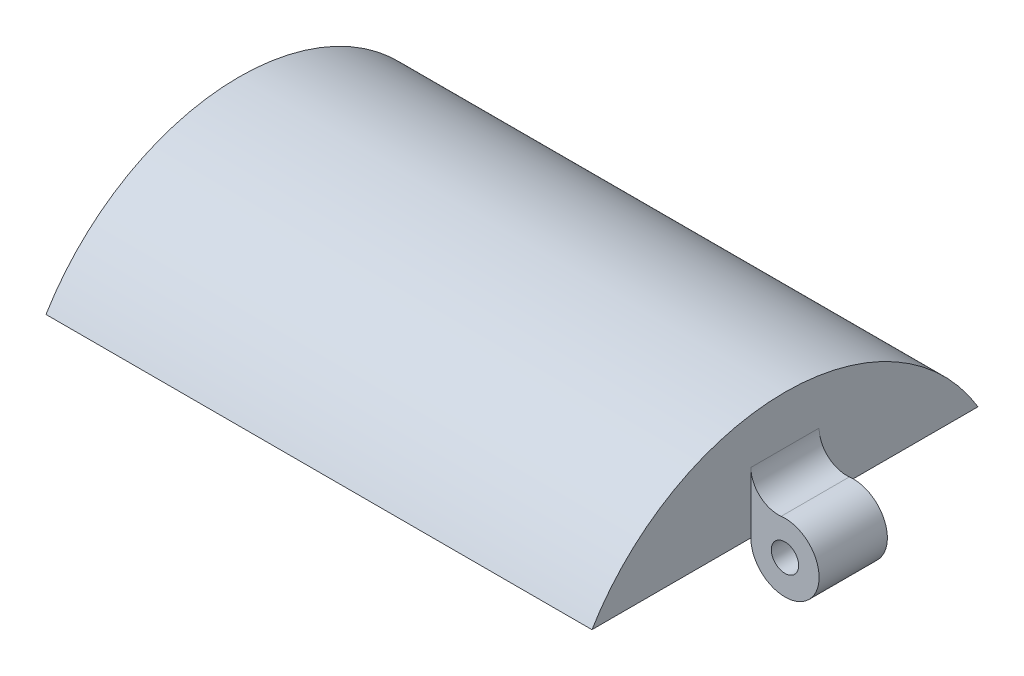
ISO-10303-21;
HEADER;
FILE_DESCRIPTION(('STEP AP214'),'2;1');
FILE_NAME('part.step','',(''),(''),'','','');
FILE_SCHEMA(('AUTOMOTIVE_DESIGN { 1 0 10303 214 1 1 1 1 }'));
ENDSEC;
DATA;
#1=APPLICATION_CONTEXT('core data for automotive mechanical design processes');
#2=APPLICATION_PROTOCOL_DEFINITION('international standard','automotive_design',2000,#1);
#3=PRODUCT_CONTEXT('',#1,'mechanical');
#4=PRODUCT('Part','Part','',(#3));
#5=PRODUCT_RELATED_PRODUCT_CATEGORY('part','',(#4));
#6=PRODUCT_DEFINITION_FORMATION('','',#4);
#7=PRODUCT_DEFINITION_CONTEXT('part definition',#1,'design');
#8=PRODUCT_DEFINITION('design','',#6,#7);
#9=PRODUCT_DEFINITION_SHAPE('','',#8);
#10=(LENGTH_UNIT() NAMED_UNIT(*) SI_UNIT(.MILLI.,.METRE.));
#11=(NAMED_UNIT(*) PLANE_ANGLE_UNIT() SI_UNIT($,.RADIAN.));
#12=(NAMED_UNIT(*) SI_UNIT($,.STERADIAN.) SOLID_ANGLE_UNIT());
#13=UNCERTAINTY_MEASURE_WITH_UNIT(LENGTH_MEASURE(1.E-05),#10,'distance_accuracy_value','');
#14=(GEOMETRIC_REPRESENTATION_CONTEXT(3) GLOBAL_UNCERTAINTY_ASSIGNED_CONTEXT((#13)) GLOBAL_UNIT_ASSIGNED_CONTEXT((#10,
#11,#12)) REPRESENTATION_CONTEXT('',''));
#15=CARTESIAN_POINT('',(0.,0.,0.));
#16=DIRECTION('',(0.,0.,1.));
#17=DIRECTION('',(1.,0.,0.));
#18=AXIS2_PLACEMENT_3D('',#15,#16,#17);
#19=CARTESIAN_POINT('',(40.,8.5,-16.5));
#20=DIRECTION('',(0.,1.,0.));
#21=DIRECTION('',(0.,0.,1.));
#22=AXIS2_PLACEMENT_3D('',#19,#20,#21);
#23=PLANE('',#22);
#24=DIRECTION('',(0.,0.,-1.));
#25=VECTOR('',#24,1.);
#26=CARTESIAN_POINT('',(40.,8.5,-16.5));
#27=LINE('',#26,#25);
#28=CARTESIAN_POINT('',(40.,8.5,14.142135623731));
#29=VERTEX_POINT('',#28);
#30=CARTESIAN_POINT('',(40.,8.5,2.5));
#31=VERTEX_POINT('',#30);
#32=EDGE_CURVE('E276',#29,#31,#27,.T.);
#33=ORIENTED_EDGE('',*,*,#32,.F.);
#34=DIRECTION('',(-1.,0.,0.));
#35=VECTOR('',#34,1.);
#36=CARTESIAN_POINT('',(40.,8.5,14.142135623731));
#37=LINE('',#36,#35);
#38=CARTESIAN_POINT('',(0.,8.5,14.142135623731));
#39=VERTEX_POINT('',#38);
#40=EDGE_CURVE('E279',#39,#29,#37,.F.);
#41=ORIENTED_EDGE('',*,*,#40,.F.);
#42=DIRECTION('',(0.,0.,1.));
#43=VECTOR('',#42,1.);
#44=CARTESIAN_POINT('',(0.,8.5,0.));
#45=LINE('',#44,#43);
#46=CARTESIAN_POINT('',(0.,8.5,2.5));
#47=VERTEX_POINT('',#46);
#48=EDGE_CURVE('E51',#47,#39,#45,.T.);
#49=ORIENTED_EDGE('',*,*,#48,.F.);
#50=DIRECTION('',(0.,0.,-1.));
#51=VECTOR('',#50,1.);
#52=CARTESIAN_POINT('',(0.,8.5,2.5));
#53=LINE('',#52,#51);
#54=CARTESIAN_POINT('',(0.,8.5,-2.5));
#55=VERTEX_POINT('',#54);
#56=EDGE_CURVE('E169',#47,#55,#53,.T.);
#57=ORIENTED_EDGE('',*,*,#56,.T.);
#58=CARTESIAN_POINT('',(0.,8.5,-14.142135623731));
#59=VERTEX_POINT('',#58);
#60=EDGE_CURVE('E12',#59,#55,#45,.T.);
#61=ORIENTED_EDGE('',*,*,#60,.F.);
#62=DIRECTION('',(-1.,0.,0.));
#63=VECTOR('',#62,1.);
#64=CARTESIAN_POINT('',(40.,8.5,-14.142135623731));
#65=LINE('',#64,#63);
#66=CARTESIAN_POINT('',(40.,8.5,-14.142135623731));
#67=VERTEX_POINT('',#66);
#68=EDGE_CURVE('E282',#67,#59,#65,.T.);
#69=ORIENTED_EDGE('',*,*,#68,.F.);
#70=CARTESIAN_POINT('',(40.,8.5,-2.5));
#71=VERTEX_POINT('',#70);
#72=EDGE_CURVE('E275',#71,#67,#27,.T.);
#73=ORIENTED_EDGE('',*,*,#72,.F.);
#74=DIRECTION('',(0.,0.,-1.));
#75=VECTOR('',#74,1.);
#76=CARTESIAN_POINT('',(40.,8.5,2.5));
#77=LINE('',#76,#75);
#78=EDGE_CURVE('E199',#31,#71,#77,.T.);
#79=ORIENTED_EDGE('',*,*,#78,.F.);
#80=EDGE_LOOP('',(#33,#41,#49,#57,#61,#69,#73,#79));
#81=FACE_BOUND('',#80,.T.);
#82=DIRECTION('',(0.,0.,-1.));
#83=VECTOR('',#82,1.);
#84=CARTESIAN_POINT('',(1.5,8.5,12.642135623731));
#85=LINE('',#84,#83);
#86=CARTESIAN_POINT('',(1.5,8.5,12.642135623731));
#87=VERTEX_POINT('',#86);
#88=CARTESIAN_POINT('',(1.5,8.5,-12.642135623731));
#89=VERTEX_POINT('',#88);
#90=EDGE_CURVE('E226',#87,#89,#85,.T.);
#91=ORIENTED_EDGE('',*,*,#90,.F.);
#92=DIRECTION('',(-1.,0.,0.));
#93=VECTOR('',#92,1.);
#94=CARTESIAN_POINT('',(1.5,8.5,12.642135623731));
#95=LINE('',#94,#93);
#96=CARTESIAN_POINT('',(38.5,8.5,12.642135623731));
#97=VERTEX_POINT('',#96);
#98=EDGE_CURVE('E231',#97,#87,#95,.T.);
#99=ORIENTED_EDGE('',*,*,#98,.F.);
#100=DIRECTION('',(0.,0.,1.));
#101=VECTOR('',#100,1.);
#102=CARTESIAN_POINT('',(38.5,8.5,12.642135623731));
#103=LINE('',#102,#101);
#104=CARTESIAN_POINT('',(38.5,8.5,-12.642135623731));
#105=VERTEX_POINT('',#104);
#106=EDGE_CURVE('E243',#105,#97,#103,.T.);
#107=ORIENTED_EDGE('',*,*,#106,.F.);
#108=DIRECTION('',(1.,0.,0.));
#109=VECTOR('',#108,1.);
#110=CARTESIAN_POINT('',(1.5,8.5,-12.642135623731));
#111=LINE('',#110,#109);
#112=EDGE_CURVE('E240',#89,#105,#111,.T.);
#113=ORIENTED_EDGE('',*,*,#112,.F.);
#114=EDGE_LOOP('',(#91,#99,#107,#113));
#115=FACE_BOUND('',#114,.T.);
#116=ADVANCED_FACE('F43',(#81,#115),#23,.F.);
#117=CARTESIAN_POINT('',(40.,0.,0.));
#118=DIRECTION('',(-1.,0.,0.));
#119=DIRECTION('',(0.,0.,1.));
#120=AXIS2_PLACEMENT_3D('',#117,#118,#119);
#121=CYLINDRICAL_SURFACE('',#120,16.5);
#122=CARTESIAN_POINT('',(40.,0.,0.));
#123=DIRECTION('',(1.,0.,0.));
#124=DIRECTION('',(0.,0.,-1.));
#125=AXIS2_PLACEMENT_3D('',#122,#123,#124);
#126=CIRCLE('',#125,16.5);
#127=EDGE_CURVE('E286',#67,#29,#126,.T.);
#128=ORIENTED_EDGE('',*,*,#127,.F.);
#129=ORIENTED_EDGE('',*,*,#68,.T.);
#130=CARTESIAN_POINT('',(0.,0.,0.));
#131=DIRECTION('',(1.,0.,0.));
#132=DIRECTION('',(0.,0.,-1.));
#133=AXIS2_PLACEMENT_3D('',#130,#131,#132);
#134=CIRCLE('',#133,16.5);
#135=EDGE_CURVE('E285',#59,#39,#134,.T.);
#136=ORIENTED_EDGE('',*,*,#135,.T.);
#137=ORIENTED_EDGE('',*,*,#40,.T.);
#138=EDGE_LOOP('',(#128,#129,#136,#137));
#139=FACE_BOUND('',#138,.T.);
#140=ADVANCED_FACE('F45',(#139),#121,.T.);
#141=CARTESIAN_POINT('',(40.,0.,0.));
#142=DIRECTION('',(1.,0.,0.));
#143=DIRECTION('',(0.,0.,-1.));
#144=AXIS2_PLACEMENT_3D('',#141,#142,#143);
#145=PLANE('',#144);
#146=DIRECTION('',(0.,-1.,0.));
#147=VECTOR('',#146,1.);
#148=CARTESIAN_POINT('',(40.,8.5,2.5));
#149=LINE('',#148,#147);
#150=CARTESIAN_POINT('',(40.,12.9721359549996,2.5));
#151=VERTEX_POINT('',#150);
#152=EDGE_CURVE('E197',#151,#31,#149,.T.);
#153=ORIENTED_EDGE('',*,*,#152,.F.);
#154=DIRECTION('',(0.,0.,-1.));
#155=VECTOR('',#154,1.);
#156=CARTESIAN_POINT('',(40.,12.9721359549996,2.5));
#157=LINE('',#156,#155);
#158=CARTESIAN_POINT('',(40.,12.9721359549996,-2.5));
#159=VERTEX_POINT('',#158);
#160=EDGE_CURVE('E208',#151,#159,#157,.T.);
#161=ORIENTED_EDGE('',*,*,#160,.T.);
#162=DIRECTION('',(0.,-1.,0.));
#163=VECTOR('',#162,1.);
#164=CARTESIAN_POINT('',(40.,8.5,-2.5));
#165=LINE('',#164,#163);
#166=EDGE_CURVE('E195',#159,#71,#165,.T.);
#167=ORIENTED_EDGE('',*,*,#166,.T.);
#168=ORIENTED_EDGE('',*,*,#72,.T.);
#169=ORIENTED_EDGE('',*,*,#127,.T.);
#170=ORIENTED_EDGE('',*,*,#32,.T.);
#171=EDGE_LOOP('',(#153,#161,#167,#168,#169,#170));
#172=FACE_BOUND('',#171,.T.);
#173=ADVANCED_FACE('F302',(#172),#145,.T.);
#174=CARTESIAN_POINT('',(0.,0.,0.));
#175=DIRECTION('',(1.,0.,0.));
#176=DIRECTION('',(0.,0.,-1.));
#177=AXIS2_PLACEMENT_3D('',#174,#175,#176);
#178=PLANE('',#177);
#179=DIRECTION('',(0.,0.,-1.));
#180=VECTOR('',#179,1.);
#181=CARTESIAN_POINT('',(0.,12.9721359549996,2.5));
#182=LINE('',#181,#180);
#183=CARTESIAN_POINT('',(0.,12.9721359549996,2.5));
#184=VERTEX_POINT('',#183);
#185=CARTESIAN_POINT('',(0.,12.9721359549996,-2.5));
#186=VERTEX_POINT('',#185);
#187=EDGE_CURVE('E58',#184,#186,#182,.T.);
#188=ORIENTED_EDGE('',*,*,#187,.F.);
#189=DIRECTION('',(0.,-1.,0.));
#190=VECTOR('',#189,1.);
#191=CARTESIAN_POINT('',(0.,8.5,2.5));
#192=LINE('',#191,#190);
#193=EDGE_CURVE('E171',#184,#47,#192,.T.);
#194=ORIENTED_EDGE('',*,*,#193,.T.);
#195=ORIENTED_EDGE('',*,*,#48,.T.);
#196=ORIENTED_EDGE('',*,*,#135,.F.);
#197=ORIENTED_EDGE('',*,*,#60,.T.);
#198=DIRECTION('',(0.,-1.,0.));
#199=VECTOR('',#198,1.);
#200=CARTESIAN_POINT('',(0.,8.5,-2.5));
#201=LINE('',#200,#199);
#202=EDGE_CURVE('E62',#186,#55,#201,.T.);
#203=ORIENTED_EDGE('',*,*,#202,.F.);
#204=EDGE_LOOP('',(#188,#194,#195,#196,#197,#203));
#205=FACE_BOUND('',#204,.T.);
#206=ADVANCED_FACE('F294',(#205),#178,.F.);
#207=CARTESIAN_POINT('',(0.,7.,0.));
#208=DIRECTION('',(0.,-1.,0.));
#209=DIRECTION('',(0.,0.,-1.));
#210=AXIS2_PLACEMENT_3D('',#207,#208,#209);
#211=PLANE('',#210);
#212=DIRECTION('',(0.,0.,-1.));
#213=VECTOR('',#212,1.);
#214=CARTESIAN_POINT('',(1.5,7.,12.642135623731));
#215=LINE('',#214,#213);
#216=CARTESIAN_POINT('',(1.5,7.,12.642135623731));
#217=VERTEX_POINT('',#216);
#218=CARTESIAN_POINT('',(1.5,7.,-12.642135623731));
#219=VERTEX_POINT('',#218);
#220=EDGE_CURVE('E227',#217,#219,#215,.T.);
#221=ORIENTED_EDGE('',*,*,#220,.T.);
#222=DIRECTION('',(1.,0.,0.));
#223=VECTOR('',#222,1.);
#224=CARTESIAN_POINT('',(1.5,7.,-12.642135623731));
#225=LINE('',#224,#223);
#226=CARTESIAN_POINT('',(38.5,7.,-12.642135623731));
#227=VERTEX_POINT('',#226);
#228=EDGE_CURVE('E230',#219,#227,#225,.T.);
#229=ORIENTED_EDGE('',*,*,#228,.T.);
#230=DIRECTION('',(0.,0.,1.));
#231=VECTOR('',#230,1.);
#232=CARTESIAN_POINT('',(38.5,7.,12.642135623731));
#233=LINE('',#232,#231);
#234=CARTESIAN_POINT('',(38.5,7.,12.642135623731));
#235=VERTEX_POINT('',#234);
#236=EDGE_CURVE('E233',#227,#235,#233,.T.);
#237=ORIENTED_EDGE('',*,*,#236,.T.);
#238=DIRECTION('',(-1.,0.,0.));
#239=VECTOR('',#238,1.);
#240=CARTESIAN_POINT('',(1.5,7.,12.642135623731));
#241=LINE('',#240,#239);
#242=EDGE_CURVE('E235',#235,#217,#241,.T.);
#243=ORIENTED_EDGE('',*,*,#242,.T.);
#244=EDGE_LOOP('',(#221,#229,#237,#243));
#245=FACE_BOUND('',#244,.T.);
#246=DIRECTION('',(0.,0.,-1.));
#247=VECTOR('',#246,1.);
#248=CARTESIAN_POINT('',(2.,7.,12.142135623731));
#249=LINE('',#248,#247);
#250=CARTESIAN_POINT('',(2.,7.,12.142135623731));
#251=VERTEX_POINT('',#250);
#252=CARTESIAN_POINT('',(2.,7.,-12.142135623731));
#253=VERTEX_POINT('',#252);
#254=EDGE_CURVE('E217',#251,#253,#249,.T.);
#255=ORIENTED_EDGE('',*,*,#254,.F.);
#256=DIRECTION('',(-1.,0.,0.));
#257=VECTOR('',#256,1.);
#258=CARTESIAN_POINT('',(38.,7.,12.142135623731));
#259=LINE('',#258,#257);
#260=CARTESIAN_POINT('',(38.,7.,12.142135623731));
#261=VERTEX_POINT('',#260);
#262=EDGE_CURVE('E214',#261,#251,#259,.T.);
#263=ORIENTED_EDGE('',*,*,#262,.F.);
#264=DIRECTION('',(0.,0.,1.));
#265=VECTOR('',#264,1.);
#266=CARTESIAN_POINT('',(38.,7.,12.142135623731));
#267=LINE('',#266,#265);
#268=CARTESIAN_POINT('',(38.,7.,-12.142135623731));
#269=VERTEX_POINT('',#268);
#270=EDGE_CURVE('E223',#269,#261,#267,.T.);
#271=ORIENTED_EDGE('',*,*,#270,.F.);
#272=DIRECTION('',(1.,0.,0.));
#273=VECTOR('',#272,1.);
#274=CARTESIAN_POINT('',(38.,7.,-12.142135623731));
#275=LINE('',#274,#273);
#276=EDGE_CURVE('E220',#253,#269,#275,.T.);
#277=ORIENTED_EDGE('',*,*,#276,.F.);
#278=EDGE_LOOP('',(#255,#263,#271,#277));
#279=FACE_BOUND('',#278,.T.);
#280=ADVANCED_FACE('F330',(#245,#279),#211,.T.);
#281=CARTESIAN_POINT('',(1.5,7.,12.642135623731));
#282=DIRECTION('',(1.,0.,0.));
#283=DIRECTION('',(0.,0.,-1.));
#284=AXIS2_PLACEMENT_3D('',#281,#282,#283);
#285=PLANE('',#284);
#286=ORIENTED_EDGE('',*,*,#90,.T.);
#287=DIRECTION('',(0.,1.,0.));
#288=VECTOR('',#287,1.);
#289=CARTESIAN_POINT('',(1.5,7.,-12.642135623731));
#290=LINE('',#289,#288);
#291=EDGE_CURVE('E256',#219,#89,#290,.T.);
#292=ORIENTED_EDGE('',*,*,#291,.F.);
#293=ORIENTED_EDGE('',*,*,#220,.F.);
#294=DIRECTION('',(0.,1.,0.));
#295=VECTOR('',#294,1.);
#296=CARTESIAN_POINT('',(1.5,7.,12.642135623731));
#297=LINE('',#296,#295);
#298=EDGE_CURVE('E237',#217,#87,#297,.T.);
#299=ORIENTED_EDGE('',*,*,#298,.T.);
#300=EDGE_LOOP('',(#286,#292,#293,#299));
#301=FACE_BOUND('',#300,.T.);
#302=ADVANCED_FACE('F334',(#301),#285,.F.);
#303=CARTESIAN_POINT('',(1.5,7.,-12.642135623731));
#304=DIRECTION('',(0.,0.,1.));
#305=DIRECTION('',(1.,0.,0.));
#306=AXIS2_PLACEMENT_3D('',#303,#304,#305);
#307=PLANE('',#306);
#308=ORIENTED_EDGE('',*,*,#112,.T.);
#309=DIRECTION('',(0.,1.,0.));
#310=VECTOR('',#309,1.);
#311=CARTESIAN_POINT('',(38.5,7.,-12.642135623731));
#312=LINE('',#311,#310);
#313=EDGE_CURVE('E253',#227,#105,#312,.T.);
#314=ORIENTED_EDGE('',*,*,#313,.F.);
#315=ORIENTED_EDGE('',*,*,#228,.F.);
#316=ORIENTED_EDGE('',*,*,#291,.T.);
#317=EDGE_LOOP('',(#308,#314,#315,#316));
#318=FACE_BOUND('',#317,.T.);
#319=ADVANCED_FACE('F340',(#318),#307,.F.);
#320=CARTESIAN_POINT('',(38.5,7.,12.642135623731));
#321=DIRECTION('',(-1.,0.,0.));
#322=DIRECTION('',(0.,0.,1.));
#323=AXIS2_PLACEMENT_3D('',#320,#321,#322);
#324=PLANE('',#323);
#325=ORIENTED_EDGE('',*,*,#106,.T.);
#326=DIRECTION('',(0.,1.,0.));
#327=VECTOR('',#326,1.);
#328=CARTESIAN_POINT('',(38.5,7.,12.642135623731));
#329=LINE('',#328,#327);
#330=EDGE_CURVE('E250',#235,#97,#329,.T.);
#331=ORIENTED_EDGE('',*,*,#330,.F.);
#332=ORIENTED_EDGE('',*,*,#236,.F.);
#333=ORIENTED_EDGE('',*,*,#313,.T.);
#334=EDGE_LOOP('',(#325,#331,#332,#333));
#335=FACE_BOUND('',#334,.T.);
#336=ADVANCED_FACE('F352',(#335),#324,.F.);
#337=CARTESIAN_POINT('',(1.5,7.,12.642135623731));
#338=DIRECTION('',(0.,0.,-1.));
#339=DIRECTION('',(-1.,0.,0.));
#340=AXIS2_PLACEMENT_3D('',#337,#338,#339);
#341=PLANE('',#340);
#342=ORIENTED_EDGE('',*,*,#98,.T.);
#343=ORIENTED_EDGE('',*,*,#298,.F.);
#344=ORIENTED_EDGE('',*,*,#242,.F.);
#345=ORIENTED_EDGE('',*,*,#330,.T.);
#346=EDGE_LOOP('',(#342,#343,#344,#345));
#347=FACE_BOUND('',#346,.T.);
#348=ADVANCED_FACE('F348',(#347),#341,.F.);
#349=CARTESIAN_POINT('',(40.,0.,0.));
#350=DIRECTION('',(-1.,0.,0.));
#351=DIRECTION('',(0.,0.,1.));
#352=AXIS2_PLACEMENT_3D('',#349,#350,#351);
#353=CYLINDRICAL_SURFACE('',#352,15.5);
#354=CARTESIAN_POINT('',(2.,0.,0.));
#355=DIRECTION('',(-1.,0.,0.));
#356=DIRECTION('',(0.,0.,1.));
#357=AXIS2_PLACEMENT_3D('',#354,#355,#356);
#358=CIRCLE('',#357,15.5);
#359=CARTESIAN_POINT('',(2.,9.63423803395597,-12.142135623731));
#360=VERTEX_POINT('',#359);
#361=CARTESIAN_POINT('',(2.,9.63423803395597,12.142135623731));
#362=VERTEX_POINT('',#361);
#363=EDGE_CURVE('E265',#360,#362,#358,.F.);
#364=ORIENTED_EDGE('',*,*,#363,.F.);
#365=DIRECTION('',(-1.,0.,0.));
#366=VECTOR('',#365,1.);
#367=CARTESIAN_POINT('',(40.,9.63423803395597,-12.142135623731));
#368=LINE('',#367,#366);
#369=CARTESIAN_POINT('',(38.,9.63423803395597,-12.142135623731));
#370=VERTEX_POINT('',#369);
#371=EDGE_CURVE('E267',#370,#360,#368,.T.);
#372=ORIENTED_EDGE('',*,*,#371,.F.);
#373=CARTESIAN_POINT('',(38.,0.,0.));
#374=DIRECTION('',(1.,0.,0.));
#375=DIRECTION('',(0.,0.,-1.));
#376=AXIS2_PLACEMENT_3D('',#373,#374,#375);
#377=CIRCLE('',#376,15.5);
#378=CARTESIAN_POINT('',(38.,9.63423803395597,12.142135623731));
#379=VERTEX_POINT('',#378);
#380=EDGE_CURVE('E260',#379,#370,#377,.F.);
#381=ORIENTED_EDGE('',*,*,#380,.F.);
#382=DIRECTION('',(-1.,0.,0.));
#383=VECTOR('',#382,1.);
#384=CARTESIAN_POINT('',(40.,9.63423803395597,12.142135623731));
#385=LINE('',#384,#383);
#386=EDGE_CURVE('E262',#362,#379,#385,.F.);
#387=ORIENTED_EDGE('',*,*,#386,.F.);
#388=EDGE_LOOP('',(#364,#372,#381,#387));
#389=FACE_BOUND('',#388,.T.);
#390=ADVANCED_FACE('F351',(#389),#353,.F.);
#391=CARTESIAN_POINT('',(2.,18.501,-12.142135623731));
#392=DIRECTION('',(0.,0.,-1.));
#393=DIRECTION('',(-1.,0.,0.));
#394=AXIS2_PLACEMENT_3D('',#391,#392,#393);
#395=PLANE('',#394);
#396=ORIENTED_EDGE('',*,*,#371,.T.);
#397=DIRECTION('',(0.,-1.,0.));
#398=VECTOR('',#397,1.);
#399=CARTESIAN_POINT('',(2.,18.501,-12.142135623731));
#400=LINE('',#399,#398);
#401=EDGE_CURVE('E259',#360,#253,#400,.T.);
#402=ORIENTED_EDGE('',*,*,#401,.T.);
#403=ORIENTED_EDGE('',*,*,#276,.T.);
#404=DIRECTION('',(0.,-1.,0.));
#405=VECTOR('',#404,1.);
#406=CARTESIAN_POINT('',(38.,18.501,-12.142135623731));
#407=LINE('',#406,#405);
#408=EDGE_CURVE('E271',#370,#269,#407,.T.);
#409=ORIENTED_EDGE('',*,*,#408,.F.);
#410=EDGE_LOOP('',(#396,#402,#403,#409));
#411=FACE_BOUND('',#410,.T.);
#412=ADVANCED_FACE('F362',(#411),#395,.F.);
#413=CARTESIAN_POINT('',(38.,18.501,12.142135623731));
#414=DIRECTION('',(1.,0.,0.));
#415=DIRECTION('',(0.,0.,-1.));
#416=AXIS2_PLACEMENT_3D('',#413,#414,#415);
#417=PLANE('',#416);
#418=ORIENTED_EDGE('',*,*,#380,.T.);
#419=ORIENTED_EDGE('',*,*,#408,.T.);
#420=ORIENTED_EDGE('',*,*,#270,.T.);
#421=DIRECTION('',(0.,-1.,0.));
#422=VECTOR('',#421,1.);
#423=CARTESIAN_POINT('',(38.,18.501,12.142135623731));
#424=LINE('',#423,#422);
#425=EDGE_CURVE('E269',#379,#261,#424,.T.);
#426=ORIENTED_EDGE('',*,*,#425,.F.);
#427=EDGE_LOOP('',(#418,#419,#420,#426));
#428=FACE_BOUND('',#427,.T.);
#429=ADVANCED_FACE('F367',(#428),#417,.F.);
#430=CARTESIAN_POINT('',(2.,18.501,12.142135623731));
#431=DIRECTION('',(0.,0.,1.));
#432=DIRECTION('',(1.,0.,0.));
#433=AXIS2_PLACEMENT_3D('',#430,#431,#432);
#434=PLANE('',#433);
#435=ORIENTED_EDGE('',*,*,#386,.T.);
#436=ORIENTED_EDGE('',*,*,#425,.T.);
#437=ORIENTED_EDGE('',*,*,#262,.T.);
#438=DIRECTION('',(0.,-1.,0.));
#439=VECTOR('',#438,1.);
#440=CARTESIAN_POINT('',(2.,18.501,12.142135623731));
#441=LINE('',#440,#439);
#442=EDGE_CURVE('E263',#362,#251,#441,.T.);
#443=ORIENTED_EDGE('',*,*,#442,.F.);
#444=EDGE_LOOP('',(#435,#436,#437,#443));
#445=FACE_BOUND('',#444,.T.);
#446=ADVANCED_FACE('F364',(#445),#434,.F.);
#447=CARTESIAN_POINT('',(2.,18.501,12.142135623731));
#448=DIRECTION('',(-1.,0.,0.));
#449=DIRECTION('',(0.,0.,1.));
#450=AXIS2_PLACEMENT_3D('',#447,#448,#449);
#451=PLANE('',#450);
#452=ORIENTED_EDGE('',*,*,#363,.T.);
#453=ORIENTED_EDGE('',*,*,#442,.T.);
#454=ORIENTED_EDGE('',*,*,#254,.T.);
#455=ORIENTED_EDGE('',*,*,#401,.F.);
#456=EDGE_LOOP('',(#452,#453,#454,#455));
#457=FACE_BOUND('',#456,.T.);
#458=ADVANCED_FACE('F326',(#457),#451,.F.);
#459=CARTESIAN_POINT('',(42.5,8.5,2.5));
#460=DIRECTION('',(0.,0.,1.));
#461=DIRECTION('',(1.,0.,0.));
#462=AXIS2_PLACEMENT_3D('',#459,#460,#461);
#463=PLANE('',#462);
#464=CARTESIAN_POINT('',(42.5,8.5,2.5));
#465=DIRECTION('',(0.,0.,1.));
#466=DIRECTION('',(1.,0.,0.));
#467=AXIS2_PLACEMENT_3D('',#464,#465,#466);
#468=CIRCLE('',#467,2.5);
#469=CARTESIAN_POINT('',(42.2222222222222,10.9845199749998,2.5));
#470=VERTEX_POINT('',#469);
#471=EDGE_CURVE('E191',#31,#470,#468,.T.);
#472=ORIENTED_EDGE('',*,*,#471,.T.);
#473=CARTESIAN_POINT('',(42.,12.9721359549996,2.5));
#474=DIRECTION('',(0.,0.,-1.));
#475=DIRECTION('',(1.,0.,0.));
#476=AXIS2_PLACEMENT_3D('',#473,#474,#475);
#477=CIRCLE('',#476,2.);
#478=EDGE_CURVE('E194',#470,#151,#477,.T.);
#479=ORIENTED_EDGE('',*,*,#478,.T.);
#480=ORIENTED_EDGE('',*,*,#152,.T.);
#481=EDGE_LOOP('',(#472,#479,#480));
#482=FACE_BOUND('',#481,.T.);
#483=CARTESIAN_POINT('',(42.5,8.5,2.5));
#484=DIRECTION('',(0.,0.,1.));
#485=DIRECTION('',(1.,0.,0.));
#486=AXIS2_PLACEMENT_3D('',#483,#484,#485);
#487=CIRCLE('',#486,0.999999999999998);
#488=CARTESIAN_POINT('',(43.5,8.5,2.5));
#489=VERTEX_POINT('',#488);
#490=EDGE_CURVE('E185',#489,#489,#487,.T.);
#491=ORIENTED_EDGE('',*,*,#490,.F.);
#492=EDGE_LOOP('',(#491));
#493=FACE_BOUND('',#492,.T.);
#494=ADVANCED_FACE('F389',(#482,#493),#463,.T.);
#495=CARTESIAN_POINT('',(42.5,8.5,-2.5));
#496=DIRECTION('',(0.,0.,1.));
#497=DIRECTION('',(1.,0.,0.));
#498=AXIS2_PLACEMENT_3D('',#495,#496,#497);
#499=PLANE('',#498);
#500=CARTESIAN_POINT('',(42.5,8.5,-2.5));
#501=DIRECTION('',(0.,0.,1.));
#502=DIRECTION('',(1.,0.,0.));
#503=AXIS2_PLACEMENT_3D('',#500,#501,#502);
#504=CIRCLE('',#503,2.5);
#505=CARTESIAN_POINT('',(42.2222222222222,10.9845199749998,-2.5));
#506=VERTEX_POINT('',#505);
#507=EDGE_CURVE('E188',#71,#506,#504,.T.);
#508=ORIENTED_EDGE('',*,*,#507,.F.);
#509=ORIENTED_EDGE('',*,*,#166,.F.);
#510=CARTESIAN_POINT('',(42.,12.9721359549996,-2.5));
#511=DIRECTION('',(0.,0.,-1.));
#512=DIRECTION('',(1.,0.,0.));
#513=AXIS2_PLACEMENT_3D('',#510,#511,#512);
#514=CIRCLE('',#513,2.);
#515=EDGE_CURVE('E202',#506,#159,#514,.T.);
#516=ORIENTED_EDGE('',*,*,#515,.F.);
#517=EDGE_LOOP('',(#508,#509,#516));
#518=FACE_BOUND('',#517,.T.);
#519=CARTESIAN_POINT('',(42.5,8.5,-2.5));
#520=DIRECTION('',(0.,0.,1.));
#521=DIRECTION('',(1.,0.,0.));
#522=AXIS2_PLACEMENT_3D('',#519,#520,#521);
#523=CIRCLE('',#522,0.999999999999998);
#524=CARTESIAN_POINT('',(43.5,8.5,-2.5));
#525=VERTEX_POINT('',#524);
#526=EDGE_CURVE('E184',#525,#525,#523,.T.);
#527=ORIENTED_EDGE('',*,*,#526,.T.);
#528=EDGE_LOOP('',(#527));
#529=FACE_BOUND('',#528,.T.);
#530=ADVANCED_FACE('F393',(#518,#529),#499,.F.);
#531=CARTESIAN_POINT('',(42.5,8.5,2.5));
#532=DIRECTION('',(0.,0.,-1.));
#533=DIRECTION('',(-1.,0.,0.));
#534=AXIS2_PLACEMENT_3D('',#531,#532,#533);
#535=CYLINDRICAL_SURFACE('',#534,2.5);
#536=ORIENTED_EDGE('',*,*,#507,.T.);
#537=DIRECTION('',(0.,0.,-1.));
#538=VECTOR('',#537,1.);
#539=CARTESIAN_POINT('',(42.2222222222222,10.9845199749998,2.5));
#540=LINE('',#539,#538);
#541=EDGE_CURVE('E211',#470,#506,#540,.T.);
#542=ORIENTED_EDGE('',*,*,#541,.F.);
#543=ORIENTED_EDGE('',*,*,#471,.F.);
#544=ORIENTED_EDGE('',*,*,#78,.T.);
#545=EDGE_LOOP('',(#536,#542,#543,#544));
#546=FACE_BOUND('',#545,.T.);
#547=ADVANCED_FACE('F346',(#546),#535,.T.);
#548=CARTESIAN_POINT('',(42.,12.9721359549996,2.5));
#549=DIRECTION('',(0.,0.,-1.));
#550=DIRECTION('',(-1.,0.,0.));
#551=AXIS2_PLACEMENT_3D('',#548,#549,#550);
#552=CYLINDRICAL_SURFACE('',#551,2.);
#553=ORIENTED_EDGE('',*,*,#515,.T.);
#554=ORIENTED_EDGE('',*,*,#160,.F.);
#555=ORIENTED_EDGE('',*,*,#478,.F.);
#556=ORIENTED_EDGE('',*,*,#541,.T.);
#557=EDGE_LOOP('',(#553,#554,#555,#556));
#558=FACE_BOUND('',#557,.T.);
#559=ADVANCED_FACE('F405',(#558),#552,.F.);
#560=CARTESIAN_POINT('',(42.5,8.5,2.5));
#561=DIRECTION('',(0.,0.,-1.));
#562=DIRECTION('',(-1.,0.,0.));
#563=AXIS2_PLACEMENT_3D('',#560,#561,#562);
#564=CYLINDRICAL_SURFACE('',#563,0.999999999999998);
#565=ORIENTED_EDGE('',*,*,#490,.T.);
#566=EDGE_LOOP('',(#565));
#567=FACE_BOUND('',#566,.T.);
#568=ORIENTED_EDGE('',*,*,#526,.F.);
#569=EDGE_LOOP('',(#568));
#570=FACE_BOUND('',#569,.T.);
#571=ADVANCED_FACE('F403',(#567,#570),#564,.F.);
#572=CARTESIAN_POINT('',(-2.5,8.5,2.5));
#573=DIRECTION('',(0.,0.,-1.));
#574=DIRECTION('',(-1.,0.,0.));
#575=AXIS2_PLACEMENT_3D('',#572,#573,#574);
#576=CYLINDRICAL_SURFACE('',#575,2.5);
#577=CARTESIAN_POINT('',(-2.5,8.5,-2.5));
#578=DIRECTION('',(0.,0.,-1.));
#579=DIRECTION('',(-1.,0.,0.));
#580=AXIS2_PLACEMENT_3D('',#577,#578,#579);
#581=CIRCLE('',#580,2.5);
#582=CARTESIAN_POINT('',(-2.22222222222222,10.9845199749998,-2.5));
#583=VERTEX_POINT('',#582);
#584=EDGE_CURVE('E177',#55,#583,#581,.T.);
#585=ORIENTED_EDGE('',*,*,#584,.F.);
#586=ORIENTED_EDGE('',*,*,#56,.F.);
#587=CARTESIAN_POINT('',(-2.5,8.5,2.5));
#588=DIRECTION('',(0.,0.,-1.));
#589=DIRECTION('',(-1.,0.,0.));
#590=AXIS2_PLACEMENT_3D('',#587,#588,#589);
#591=CIRCLE('',#590,2.5);
#592=CARTESIAN_POINT('',(-2.22222222222222,10.9845199749998,2.5));
#593=VERTEX_POINT('',#592);
#594=EDGE_CURVE('E166',#47,#593,#591,.T.);
#595=ORIENTED_EDGE('',*,*,#594,.T.);
#596=DIRECTION('',(0.,0.,-1.));
#597=VECTOR('',#596,1.);
#598=CARTESIAN_POINT('',(-2.22222222222222,10.9845199749998,2.5));
#599=LINE('',#598,#597);
#600=EDGE_CURVE('E153',#593,#583,#599,.T.);
#601=ORIENTED_EDGE('',*,*,#600,.T.);
#602=EDGE_LOOP('',(#585,#586,#595,#601));
#603=FACE_BOUND('',#602,.T.);
#604=ADVANCED_FACE('F167',(#603),#576,.T.);
#605=CARTESIAN_POINT('',(-2.,12.9721359549996,2.5));
#606=DIRECTION('',(0.,0.,-1.));
#607=DIRECTION('',(-1.,0.,0.));
#608=AXIS2_PLACEMENT_3D('',#605,#606,#607);
#609=CYLINDRICAL_SURFACE('',#608,2.);
#610=CARTESIAN_POINT('',(-2.,12.9721359549996,-2.5));
#611=DIRECTION('',(0.,0.,1.));
#612=DIRECTION('',(-1.,0.,0.));
#613=AXIS2_PLACEMENT_3D('',#610,#611,#612);
#614=CIRCLE('',#613,2.);
#615=EDGE_CURVE('E159',#583,#186,#614,.T.);
#616=ORIENTED_EDGE('',*,*,#615,.F.);
#617=ORIENTED_EDGE('',*,*,#600,.F.);
#618=CARTESIAN_POINT('',(-2.,12.9721359549996,2.5));
#619=DIRECTION('',(0.,0.,1.));
#620=DIRECTION('',(-1.,0.,0.));
#621=AXIS2_PLACEMENT_3D('',#618,#619,#620);
#622=CIRCLE('',#621,2.);
#623=EDGE_CURVE('E157',#593,#184,#622,.T.);
#624=ORIENTED_EDGE('',*,*,#623,.T.);
#625=ORIENTED_EDGE('',*,*,#187,.T.);
#626=EDGE_LOOP('',(#616,#617,#624,#625));
#627=FACE_BOUND('',#626,.T.);
#628=ADVANCED_FACE('F155',(#627),#609,.F.);
#629=CARTESIAN_POINT('',(-2.5,8.5,2.5));
#630=DIRECTION('',(0.,0.,1.));
#631=DIRECTION('',(-1.,0.,0.));
#632=AXIS2_PLACEMENT_3D('',#629,#630,#631);
#633=PLANE('',#632);
#634=CARTESIAN_POINT('',(-2.5,8.5,2.5));
#635=DIRECTION('',(0.,0.,-1.));
#636=DIRECTION('',(-1.,0.,0.));
#637=AXIS2_PLACEMENT_3D('',#634,#635,#636);
#638=CIRCLE('',#637,0.999999999999998);
#639=CARTESIAN_POINT('',(-3.5,8.5,2.5));
#640=VERTEX_POINT('',#639);
#641=EDGE_CURVE('E179',#640,#640,#638,.T.);
#642=ORIENTED_EDGE('',*,*,#641,.T.);
#643=EDGE_LOOP('',(#642));
#644=FACE_BOUND('',#643,.T.);
#645=ORIENTED_EDGE('',*,*,#594,.F.);
#646=ORIENTED_EDGE('',*,*,#193,.F.);
#647=ORIENTED_EDGE('',*,*,#623,.F.);
#648=EDGE_LOOP('',(#645,#646,#647));
#649=FACE_BOUND('',#648,.T.);
#650=ADVANCED_FACE('F173',(#644,#649),#633,.T.);
#651=CARTESIAN_POINT('',(-2.5,8.5,-2.5));
#652=DIRECTION('',(0.,0.,1.));
#653=DIRECTION('',(-1.,0.,0.));
#654=AXIS2_PLACEMENT_3D('',#651,#652,#653);
#655=PLANE('',#654);
#656=CARTESIAN_POINT('',(-2.5,8.5,-2.5));
#657=DIRECTION('',(0.,0.,-1.));
#658=DIRECTION('',(-1.,0.,0.));
#659=AXIS2_PLACEMENT_3D('',#656,#657,#658);
#660=CIRCLE('',#659,0.999999999999998);
#661=CARTESIAN_POINT('',(-3.5,8.5,-2.5));
#662=VERTEX_POINT('',#661);
#663=EDGE_CURVE('E572',#662,#662,#660,.T.);
#664=ORIENTED_EDGE('',*,*,#663,.F.);
#665=EDGE_LOOP('',(#664));
#666=FACE_BOUND('',#665,.T.);
#667=ORIENTED_EDGE('',*,*,#584,.T.);
#668=ORIENTED_EDGE('',*,*,#615,.T.);
#669=ORIENTED_EDGE('',*,*,#202,.T.);
#670=EDGE_LOOP('',(#667,#668,#669));
#671=FACE_BOUND('',#670,.T.);
#672=ADVANCED_FACE('F304',(#666,#671),#655,.F.);
#673=CARTESIAN_POINT('',(-2.5,8.5,2.5));
#674=DIRECTION('',(0.,0.,-1.));
#675=DIRECTION('',(-1.,0.,0.));
#676=AXIS2_PLACEMENT_3D('',#673,#674,#675);
#677=CYLINDRICAL_SURFACE('',#676,0.999999999999998);
#678=ORIENTED_EDGE('',*,*,#641,.F.);
#679=EDGE_LOOP('',(#678));
#680=FACE_BOUND('',#679,.T.);
#681=ORIENTED_EDGE('',*,*,#663,.T.);
#682=EDGE_LOOP('',(#681));
#683=FACE_BOUND('',#682,.T.);
#684=ADVANCED_FACE('F306',(#680,#683),#677,.F.);
#685=CLOSED_SHELL('',(#116,#140,#173,#206,#280,#302,#319,#336,#348,#390,#412,#429,#446,#458,
#494,#530,#547,#559,#571,#604,#628,#650,#672,#684));
#686=MANIFOLD_SOLID_BREP('B2',#685);
#687=ADVANCED_BREP_SHAPE_REPRESENTATION('',(#18,#686),#14);
#688=SHAPE_DEFINITION_REPRESENTATION(#9,#687);
ENDSEC;
END-ISO-10303-21;
